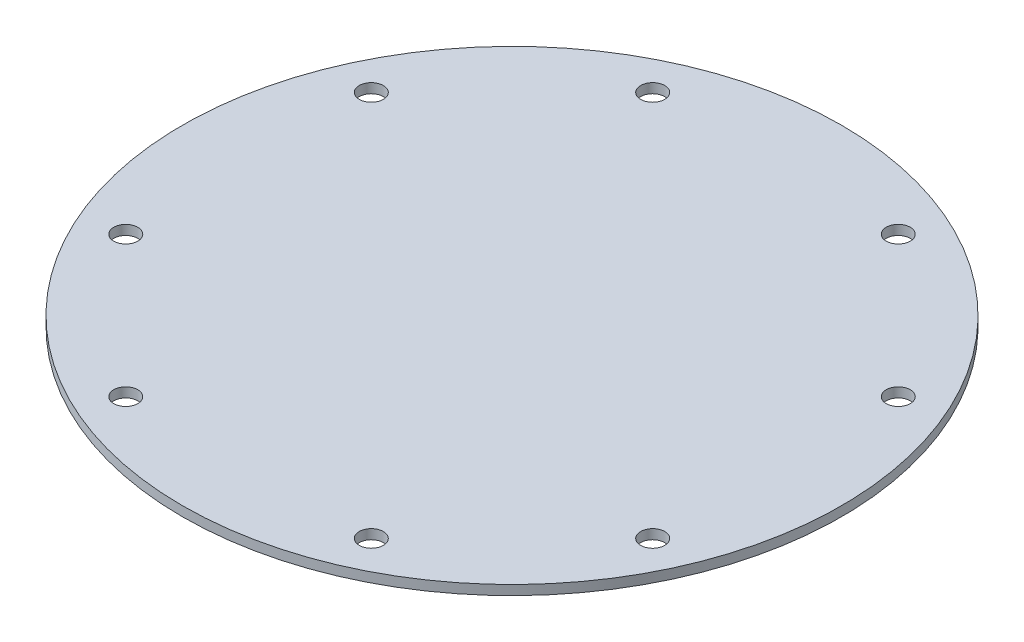
ISO-10303-21;
HEADER;
FILE_DESCRIPTION(('STEP AP214'),'2;1');
FILE_NAME('part.step','',(''),(''),'','','');
FILE_SCHEMA(('AUTOMOTIVE_DESIGN { 1 0 10303 214 1 1 1 1 }'));
ENDSEC;
DATA;
#1=APPLICATION_CONTEXT('core data for automotive mechanical design processes');
#2=APPLICATION_PROTOCOL_DEFINITION('international standard','automotive_design',2000,#1);
#3=PRODUCT_CONTEXT('',#1,'mechanical');
#4=PRODUCT('Part','Part','',(#3));
#5=PRODUCT_RELATED_PRODUCT_CATEGORY('part','',(#4));
#6=PRODUCT_DEFINITION_FORMATION('','',#4);
#7=PRODUCT_DEFINITION_CONTEXT('part definition',#1,'design');
#8=PRODUCT_DEFINITION('design','',#6,#7);
#9=PRODUCT_DEFINITION_SHAPE('','',#8);
#10=(LENGTH_UNIT() NAMED_UNIT(*) SI_UNIT(.MILLI.,.METRE.));
#11=(NAMED_UNIT(*) PLANE_ANGLE_UNIT() SI_UNIT($,.RADIAN.));
#12=(NAMED_UNIT(*) SI_UNIT($,.STERADIAN.) SOLID_ANGLE_UNIT());
#13=UNCERTAINTY_MEASURE_WITH_UNIT(LENGTH_MEASURE(1.E-05),#10,'distance_accuracy_value','');
#14=(GEOMETRIC_REPRESENTATION_CONTEXT(3) GLOBAL_UNCERTAINTY_ASSIGNED_CONTEXT((#13)) GLOBAL_UNIT_ASSIGNED_CONTEXT((#10,
#11,#12)) REPRESENTATION_CONTEXT('',''));
#15=CARTESIAN_POINT('',(0.,0.,0.));
#16=DIRECTION('',(0.,0.,1.));
#17=DIRECTION('',(1.,0.,0.));
#18=AXIS2_PLACEMENT_3D('',#15,#16,#17);
#19=CARTESIAN_POINT('',(0.,2.54,0.));
#20=DIRECTION('',(0.,1.,0.));
#21=DIRECTION('',(0.,0.,1.));
#22=AXIS2_PLACEMENT_3D('',#19,#20,#21);
#23=PLANE('',#22);
#24=CARTESIAN_POINT('',(32.385,2.54,-69.50075));
#25=DIRECTION('',(0.,-1.,0.));
#26=DIRECTION('',(0.,0.,-1.));
#27=AXIS2_PLACEMENT_3D('',#24,#25,#26);
#28=CIRCLE('',#27,3.17499999999999);
#29=CARTESIAN_POINT('',(32.385,2.54,-72.67575));
#30=VERTEX_POINT('',#29);
#31=EDGE_CURVE('E142',#30,#30,#28,.T.);
#32=ORIENTED_EDGE('',*,*,#31,.T.);
#33=EDGE_LOOP('',(#32));
#34=FACE_BOUND('',#33,.T.);
#35=CARTESIAN_POINT('',(-32.385,2.54,-69.50075));
#36=DIRECTION('',(0.,1.,0.));
#37=DIRECTION('',(0.,0.,1.));
#38=AXIS2_PLACEMENT_3D('',#35,#36,#37);
#39=CIRCLE('',#38,3.17499999999999);
#40=CARTESIAN_POINT('',(-32.385,2.54,-66.32575));
#41=VERTEX_POINT('',#40);
#42=EDGE_CURVE('E138',#41,#41,#39,.T.);
#43=ORIENTED_EDGE('',*,*,#42,.F.);
#44=EDGE_LOOP('',(#43));
#45=FACE_BOUND('',#44,.T.);
#46=CARTESIAN_POINT('',(-32.385,2.54,69.50075));
#47=DIRECTION('',(0.,-1.,0.));
#48=DIRECTION('',(0.,0.,-1.));
#49=AXIS2_PLACEMENT_3D('',#46,#47,#48);
#50=CIRCLE('',#49,3.175);
#51=CARTESIAN_POINT('',(-32.385,2.54,66.32575));
#52=VERTEX_POINT('',#51);
#53=EDGE_CURVE('E144',#52,#52,#50,.T.);
#54=ORIENTED_EDGE('',*,*,#53,.T.);
#55=EDGE_LOOP('',(#54));
#56=FACE_BOUND('',#55,.T.);
#57=CARTESIAN_POINT('',(32.385,2.54,69.50075));
#58=DIRECTION('',(0.,1.,0.));
#59=DIRECTION('',(0.,0.,1.));
#60=AXIS2_PLACEMENT_3D('',#57,#58,#59);
#61=CIRCLE('',#60,3.175);
#62=CARTESIAN_POINT('',(32.385,2.54,72.67575));
#63=VERTEX_POINT('',#62);
#64=EDGE_CURVE('E56',#63,#63,#61,.T.);
#65=ORIENTED_EDGE('',*,*,#64,.F.);
#66=EDGE_LOOP('',(#65));
#67=FACE_BOUND('',#66,.T.);
#68=CARTESIAN_POINT('',(0.,2.54,0.));
#69=DIRECTION('',(0.,1.,0.));
#70=DIRECTION('',(0.,0.,1.));
#71=AXIS2_PLACEMENT_3D('',#68,#69,#70);
#72=CIRCLE('',#71,86.9315);
#73=CARTESIAN_POINT('',(0.,2.54,86.9315));
#74=VERTEX_POINT('',#73);
#75=EDGE_CURVE('E10',#74,#74,#72,.T.);
#76=ORIENTED_EDGE('',*,*,#75,.T.);
#77=EDGE_LOOP('',(#76));
#78=FACE_BOUND('',#77,.T.);
#79=CARTESIAN_POINT('',(-69.50075,2.54,32.385));
#80=DIRECTION('',(0.,1.,0.));
#81=DIRECTION('',(0.,0.,1.));
#82=AXIS2_PLACEMENT_3D('',#79,#80,#81);
#83=CIRCLE('',#82,3.175);
#84=CARTESIAN_POINT('',(-69.50075,2.54,35.56));
#85=VERTEX_POINT('',#84);
#86=EDGE_CURVE('E139',#85,#85,#83,.T.);
#87=ORIENTED_EDGE('',*,*,#86,.F.);
#88=EDGE_LOOP('',(#87));
#89=FACE_BOUND('',#88,.T.);
#90=CARTESIAN_POINT('',(-69.50075,2.54,-32.385));
#91=DIRECTION('',(0.,-1.,0.));
#92=DIRECTION('',(0.,0.,-1.));
#93=AXIS2_PLACEMENT_3D('',#90,#91,#92);
#94=CIRCLE('',#93,3.175);
#95=CARTESIAN_POINT('',(-69.50075,2.54,-35.56));
#96=VERTEX_POINT('',#95);
#97=EDGE_CURVE('E131',#96,#96,#94,.T.);
#98=ORIENTED_EDGE('',*,*,#97,.T.);
#99=EDGE_LOOP('',(#98));
#100=FACE_BOUND('',#99,.T.);
#101=CARTESIAN_POINT('',(69.50075,2.54,-32.385));
#102=DIRECTION('',(0.,1.,0.));
#103=DIRECTION('',(0.,0.,1.));
#104=AXIS2_PLACEMENT_3D('',#101,#102,#103);
#105=CIRCLE('',#104,3.175);
#106=CARTESIAN_POINT('',(69.50075,2.54,-29.21));
#107=VERTEX_POINT('',#106);
#108=EDGE_CURVE('E152',#107,#107,#105,.T.);
#109=ORIENTED_EDGE('',*,*,#108,.F.);
#110=EDGE_LOOP('',(#109));
#111=FACE_BOUND('',#110,.T.);
#112=CARTESIAN_POINT('',(69.50075,2.54,32.385));
#113=DIRECTION('',(0.,-1.,0.));
#114=DIRECTION('',(0.,0.,-1.));
#115=AXIS2_PLACEMENT_3D('',#112,#113,#114);
#116=CIRCLE('',#115,3.175);
#117=CARTESIAN_POINT('',(69.50075,2.54,29.21));
#118=VERTEX_POINT('',#117);
#119=EDGE_CURVE('E149',#118,#118,#116,.T.);
#120=ORIENTED_EDGE('',*,*,#119,.T.);
#121=EDGE_LOOP('',(#120));
#122=FACE_BOUND('',#121,.T.);
#123=ADVANCED_FACE('F41',(#34,#45,#56,#67,#78,#89,#100,#111,#122),#23,.T.);
#124=CARTESIAN_POINT('',(0.,0.,0.));
#125=DIRECTION('',(0.,1.,0.));
#126=DIRECTION('',(0.,0.,1.));
#127=AXIS2_PLACEMENT_3D('',#124,#125,#126);
#128=PLANE('',#127);
#129=CARTESIAN_POINT('',(69.50075,0.,-32.385));
#130=DIRECTION('',(0.,1.,0.));
#131=DIRECTION('',(0.,0.,1.));
#132=AXIS2_PLACEMENT_3D('',#129,#130,#131);
#133=CIRCLE('',#132,3.175);
#134=CARTESIAN_POINT('',(69.50075,0.,-29.21));
#135=VERTEX_POINT('',#134);
#136=EDGE_CURVE('E76',#135,#135,#133,.T.);
#137=ORIENTED_EDGE('',*,*,#136,.T.);
#138=EDGE_LOOP('',(#137));
#139=FACE_BOUND('',#138,.T.);
#140=CARTESIAN_POINT('',(-32.385,0.,-69.50075));
#141=DIRECTION('',(0.,1.,0.));
#142=DIRECTION('',(0.,0.,1.));
#143=AXIS2_PLACEMENT_3D('',#140,#141,#142);
#144=CIRCLE('',#143,3.17499999999999);
#145=CARTESIAN_POINT('',(-32.385,0.,-66.32575));
#146=VERTEX_POINT('',#145);
#147=EDGE_CURVE('E71',#146,#146,#144,.T.);
#148=ORIENTED_EDGE('',*,*,#147,.T.);
#149=EDGE_LOOP('',(#148));
#150=FACE_BOUND('',#149,.T.);
#151=CARTESIAN_POINT('',(-69.50075,0.,32.385));
#152=DIRECTION('',(0.,1.,0.));
#153=DIRECTION('',(0.,0.,1.));
#154=AXIS2_PLACEMENT_3D('',#151,#152,#153);
#155=CIRCLE('',#154,3.175);
#156=CARTESIAN_POINT('',(-69.50075,0.,35.56));
#157=VERTEX_POINT('',#156);
#158=EDGE_CURVE('E65',#157,#157,#155,.T.);
#159=ORIENTED_EDGE('',*,*,#158,.T.);
#160=EDGE_LOOP('',(#159));
#161=FACE_BOUND('',#160,.T.);
#162=CARTESIAN_POINT('',(32.385,0.,69.50075));
#163=DIRECTION('',(0.,1.,0.));
#164=DIRECTION('',(0.,0.,1.));
#165=AXIS2_PLACEMENT_3D('',#162,#163,#164);
#166=CIRCLE('',#165,3.175);
#167=CARTESIAN_POINT('',(32.385,0.,72.67575));
#168=VERTEX_POINT('',#167);
#169=EDGE_CURVE('E59',#168,#168,#166,.T.);
#170=ORIENTED_EDGE('',*,*,#169,.T.);
#171=EDGE_LOOP('',(#170));
#172=FACE_BOUND('',#171,.T.);
#173=CARTESIAN_POINT('',(0.,0.,0.));
#174=DIRECTION('',(0.,1.,0.));
#175=DIRECTION('',(0.,0.,1.));
#176=AXIS2_PLACEMENT_3D('',#173,#174,#175);
#177=CIRCLE('',#176,86.9315);
#178=CARTESIAN_POINT('',(0.,0.,86.9315));
#179=VERTEX_POINT('',#178);
#180=EDGE_CURVE('E49',#179,#179,#177,.T.);
#181=ORIENTED_EDGE('',*,*,#180,.F.);
#182=EDGE_LOOP('',(#181));
#183=FACE_BOUND('',#182,.T.);
#184=CARTESIAN_POINT('',(-32.385,0.,69.50075));
#185=DIRECTION('',(0.,1.,0.));
#186=DIRECTION('',(0.,0.,1.));
#187=AXIS2_PLACEMENT_3D('',#184,#185,#186);
#188=CIRCLE('',#187,3.175);
#189=CARTESIAN_POINT('',(-32.385,0.,72.67575));
#190=VERTEX_POINT('',#189);
#191=EDGE_CURVE('E62',#190,#190,#188,.F.);
#192=ORIENTED_EDGE('',*,*,#191,.F.);
#193=EDGE_LOOP('',(#192));
#194=FACE_BOUND('',#193,.T.);
#195=CARTESIAN_POINT('',(-69.50075,0.,-32.385));
#196=DIRECTION('',(0.,1.,0.));
#197=DIRECTION('',(0.,0.,1.));
#198=AXIS2_PLACEMENT_3D('',#195,#196,#197);
#199=CIRCLE('',#198,3.175);
#200=CARTESIAN_POINT('',(-69.50075,0.,-29.21));
#201=VERTEX_POINT('',#200);
#202=EDGE_CURVE('E68',#201,#201,#199,.F.);
#203=ORIENTED_EDGE('',*,*,#202,.F.);
#204=EDGE_LOOP('',(#203));
#205=FACE_BOUND('',#204,.T.);
#206=CARTESIAN_POINT('',(32.385,0.,-69.50075));
#207=DIRECTION('',(0.,1.,0.));
#208=DIRECTION('',(0.,0.,1.));
#209=AXIS2_PLACEMENT_3D('',#206,#207,#208);
#210=CIRCLE('',#209,3.17499999999999);
#211=CARTESIAN_POINT('',(32.385,0.,-66.32575));
#212=VERTEX_POINT('',#211);
#213=EDGE_CURVE('E74',#212,#212,#210,.F.);
#214=ORIENTED_EDGE('',*,*,#213,.F.);
#215=EDGE_LOOP('',(#214));
#216=FACE_BOUND('',#215,.T.);
#217=CARTESIAN_POINT('',(69.50075,0.,32.385));
#218=DIRECTION('',(0.,1.,0.));
#219=DIRECTION('',(0.,0.,1.));
#220=AXIS2_PLACEMENT_3D('',#217,#218,#219);
#221=CIRCLE('',#220,3.175);
#222=CARTESIAN_POINT('',(69.50075,0.,35.56));
#223=VERTEX_POINT('',#222);
#224=EDGE_CURVE('E45',#223,#223,#221,.F.);
#225=ORIENTED_EDGE('',*,*,#224,.F.);
#226=EDGE_LOOP('',(#225));
#227=FACE_BOUND('',#226,.T.);
#228=ADVANCED_FACE('F85',(#139,#150,#161,#172,#183,#194,#205,#216,#227),#128,.F.);
#229=CARTESIAN_POINT('',(0.,2.54,0.));
#230=DIRECTION('',(0.,-1.,0.));
#231=DIRECTION('',(0.,0.,-1.));
#232=AXIS2_PLACEMENT_3D('',#229,#230,#231);
#233=CYLINDRICAL_SURFACE('',#232,86.9315);
#234=ORIENTED_EDGE('',*,*,#75,.F.);
#235=EDGE_LOOP('',(#234));
#236=FACE_BOUND('',#235,.T.);
#237=ORIENTED_EDGE('',*,*,#180,.T.);
#238=EDGE_LOOP('',(#237));
#239=FACE_BOUND('',#238,.T.);
#240=ADVANCED_FACE('F43',(#236,#239),#233,.T.);
#241=CARTESIAN_POINT('',(32.385,-200.66,69.50075));
#242=DIRECTION('',(0.,1.,0.));
#243=DIRECTION('',(0.,0.,1.));
#244=AXIS2_PLACEMENT_3D('',#241,#242,#243);
#245=CYLINDRICAL_SURFACE('',#244,3.175);
#246=ORIENTED_EDGE('',*,*,#64,.T.);
#247=EDGE_LOOP('',(#246));
#248=FACE_BOUND('',#247,.T.);
#249=ORIENTED_EDGE('',*,*,#169,.F.);
#250=EDGE_LOOP('',(#249));
#251=FACE_BOUND('',#250,.T.);
#252=ADVANCED_FACE('F92',(#248,#251),#245,.F.);
#253=CARTESIAN_POINT('',(-32.385,-200.66,69.50075));
#254=DIRECTION('',(0.,1.,0.));
#255=DIRECTION('',(0.,0.,1.));
#256=AXIS2_PLACEMENT_3D('',#253,#254,#255);
#257=CYLINDRICAL_SURFACE('',#256,3.175);
#258=ORIENTED_EDGE('',*,*,#53,.F.);
#259=EDGE_LOOP('',(#258));
#260=FACE_BOUND('',#259,.T.);
#261=ORIENTED_EDGE('',*,*,#191,.T.);
#262=EDGE_LOOP('',(#261));
#263=FACE_BOUND('',#262,.T.);
#264=ADVANCED_FACE('F99',(#260,#263),#257,.F.);
#265=CARTESIAN_POINT('',(-69.50075,-200.66,32.385));
#266=DIRECTION('',(0.,1.,0.));
#267=DIRECTION('',(0.,0.,1.));
#268=AXIS2_PLACEMENT_3D('',#265,#266,#267);
#269=CYLINDRICAL_SURFACE('',#268,3.175);
#270=ORIENTED_EDGE('',*,*,#86,.T.);
#271=EDGE_LOOP('',(#270));
#272=FACE_BOUND('',#271,.T.);
#273=ORIENTED_EDGE('',*,*,#158,.F.);
#274=EDGE_LOOP('',(#273));
#275=FACE_BOUND('',#274,.T.);
#276=ADVANCED_FACE('F119',(#272,#275),#269,.F.);
#277=CARTESIAN_POINT('',(-69.50075,-200.66,-32.385));
#278=DIRECTION('',(0.,1.,0.));
#279=DIRECTION('',(0.,0.,1.));
#280=AXIS2_PLACEMENT_3D('',#277,#278,#279);
#281=CYLINDRICAL_SURFACE('',#280,3.175);
#282=ORIENTED_EDGE('',*,*,#97,.F.);
#283=EDGE_LOOP('',(#282));
#284=FACE_BOUND('',#283,.T.);
#285=ORIENTED_EDGE('',*,*,#202,.T.);
#286=EDGE_LOOP('',(#285));
#287=FACE_BOUND('',#286,.T.);
#288=ADVANCED_FACE('F105',(#284,#287),#281,.F.);
#289=CARTESIAN_POINT('',(-32.385,-200.66,-69.50075));
#290=DIRECTION('',(0.,1.,0.));
#291=DIRECTION('',(0.,0.,1.));
#292=AXIS2_PLACEMENT_3D('',#289,#290,#291);
#293=CYLINDRICAL_SURFACE('',#292,3.17499999999999);
#294=ORIENTED_EDGE('',*,*,#42,.T.);
#295=EDGE_LOOP('',(#294));
#296=FACE_BOUND('',#295,.T.);
#297=ORIENTED_EDGE('',*,*,#147,.F.);
#298=EDGE_LOOP('',(#297));
#299=FACE_BOUND('',#298,.T.);
#300=ADVANCED_FACE('F101',(#296,#299),#293,.F.);
#301=CARTESIAN_POINT('',(32.385,-200.66,-69.50075));
#302=DIRECTION('',(0.,1.,0.));
#303=DIRECTION('',(0.,0.,1.));
#304=AXIS2_PLACEMENT_3D('',#301,#302,#303);
#305=CYLINDRICAL_SURFACE('',#304,3.17499999999999);
#306=ORIENTED_EDGE('',*,*,#31,.F.);
#307=EDGE_LOOP('',(#306));
#308=FACE_BOUND('',#307,.T.);
#309=ORIENTED_EDGE('',*,*,#213,.T.);
#310=EDGE_LOOP('',(#309));
#311=FACE_BOUND('',#310,.T.);
#312=ADVANCED_FACE('F104',(#308,#311),#305,.F.);
#313=CARTESIAN_POINT('',(69.50075,-200.66,-32.385));
#314=DIRECTION('',(0.,1.,0.));
#315=DIRECTION('',(0.,0.,1.));
#316=AXIS2_PLACEMENT_3D('',#313,#314,#315);
#317=CYLINDRICAL_SURFACE('',#316,3.175);
#318=ORIENTED_EDGE('',*,*,#108,.T.);
#319=EDGE_LOOP('',(#318));
#320=FACE_BOUND('',#319,.T.);
#321=ORIENTED_EDGE('',*,*,#136,.F.);
#322=EDGE_LOOP('',(#321));
#323=FACE_BOUND('',#322,.T.);
#324=ADVANCED_FACE('F109',(#320,#323),#317,.F.);
#325=CARTESIAN_POINT('',(69.50075,-200.66,32.385));
#326=DIRECTION('',(0.,1.,0.));
#327=DIRECTION('',(0.,0.,1.));
#328=AXIS2_PLACEMENT_3D('',#325,#326,#327);
#329=CYLINDRICAL_SURFACE('',#328,3.175);
#330=ORIENTED_EDGE('',*,*,#119,.F.);
#331=EDGE_LOOP('',(#330));
#332=FACE_BOUND('',#331,.T.);
#333=ORIENTED_EDGE('',*,*,#224,.T.);
#334=EDGE_LOOP('',(#333));
#335=FACE_BOUND('',#334,.T.);
#336=ADVANCED_FACE('F83',(#332,#335),#329,.F.);
#337=CLOSED_SHELL('',(#123,#228,#240,#252,#264,#276,#288,#300,#312,#324,#336));
#338=MANIFOLD_SOLID_BREP('B2',#337);
#339=ADVANCED_BREP_SHAPE_REPRESENTATION('',(#18,#338),#14);
#340=SHAPE_DEFINITION_REPRESENTATION(#9,#339);
ENDSEC;
END-ISO-10303-21;
